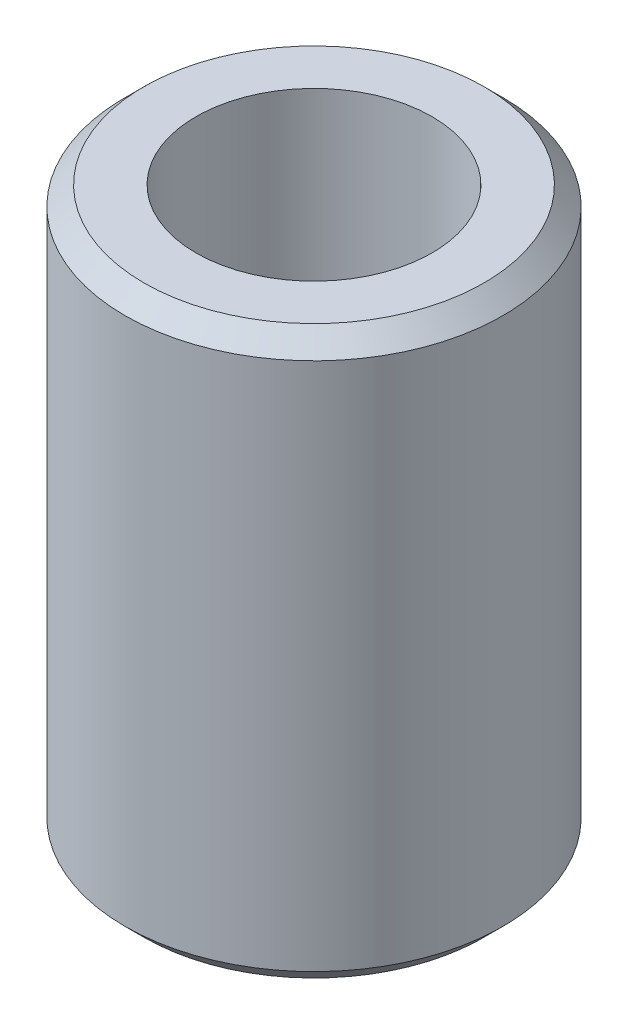
ISO-10303-21;
HEADER;
FILE_DESCRIPTION(('STEP AP214'),'2;1');
FILE_NAME('part.step','',(''),(''),'','','');
FILE_SCHEMA(('AUTOMOTIVE_DESIGN { 1 0 10303 214 1 1 1 1 }'));
ENDSEC;
DATA;
#1=APPLICATION_CONTEXT('core data for automotive mechanical design processes');
#2=APPLICATION_PROTOCOL_DEFINITION('international standard','automotive_design',2000,#1);
#3=PRODUCT_CONTEXT('',#1,'mechanical');
#4=PRODUCT('Part','Part','',(#3));
#5=PRODUCT_RELATED_PRODUCT_CATEGORY('part','',(#4));
#6=PRODUCT_DEFINITION_FORMATION('','',#4);
#7=PRODUCT_DEFINITION_CONTEXT('part definition',#1,'design');
#8=PRODUCT_DEFINITION('design','',#6,#7);
#9=PRODUCT_DEFINITION_SHAPE('','',#8);
#10=(LENGTH_UNIT() NAMED_UNIT(*) SI_UNIT(.MILLI.,.METRE.));
#11=(NAMED_UNIT(*) PLANE_ANGLE_UNIT() SI_UNIT($,.RADIAN.));
#12=(NAMED_UNIT(*) SI_UNIT($,.STERADIAN.) SOLID_ANGLE_UNIT());
#13=UNCERTAINTY_MEASURE_WITH_UNIT(LENGTH_MEASURE(1.E-05),#10,'distance_accuracy_value','');
#14=(GEOMETRIC_REPRESENTATION_CONTEXT(3) GLOBAL_UNCERTAINTY_ASSIGNED_CONTEXT((#13)) GLOBAL_UNIT_ASSIGNED_CONTEXT((#10,
#11,#12)) REPRESENTATION_CONTEXT('',''));
#15=CARTESIAN_POINT('',(0.,0.,0.));
#16=DIRECTION('',(0.,0.,1.));
#17=DIRECTION('',(1.,0.,0.));
#18=AXIS2_PLACEMENT_3D('',#15,#16,#17);
#19=CARTESIAN_POINT('',(0.,60.,0.));
#20=DIRECTION('',(0.,1.,0.));
#21=DIRECTION('',(0.,0.,1.));
#22=AXIS2_PLACEMENT_3D('',#19,#20,#21);
#23=PLANE('',#22);
#24=CARTESIAN_POINT('',(0.,60.,0.));
#25=DIRECTION('',(0.,1.,0.));
#26=DIRECTION('',(0.,0.,1.));
#27=AXIS2_PLACEMENT_3D('',#24,#25,#26);
#28=CIRCLE('',#27,18.);
#29=CARTESIAN_POINT('',(0.,60.,18.));
#30=VERTEX_POINT('',#29);
#31=EDGE_CURVE('E53',#30,#30,#28,.T.);
#32=ORIENTED_EDGE('',*,*,#31,.T.);
#33=EDGE_LOOP('',(#32));
#34=FACE_BOUND('',#33,.T.);
#35=CARTESIAN_POINT('',(0.,60.,0.));
#36=DIRECTION('',(0.,1.,0.));
#37=DIRECTION('',(0.,0.,1.));
#38=AXIS2_PLACEMENT_3D('',#35,#36,#37);
#39=CIRCLE('',#38,12.5);
#40=CARTESIAN_POINT('',(0.,60.,12.5));
#41=VERTEX_POINT('',#40);
#42=EDGE_CURVE('E58',#41,#41,#39,.T.);
#43=ORIENTED_EDGE('',*,*,#42,.F.);
#44=EDGE_LOOP('',(#43));
#45=FACE_BOUND('',#44,.T.);
#46=ADVANCED_FACE('F37',(#34,#45),#23,.T.);
#47=CARTESIAN_POINT('',(0.,0.,0.));
#48=DIRECTION('',(0.,1.,0.));
#49=DIRECTION('',(0.,0.,1.));
#50=AXIS2_PLACEMENT_3D('',#47,#48,#49);
#51=PLANE('',#50);
#52=CARTESIAN_POINT('',(0.,0.,0.));
#53=DIRECTION('',(0.,1.,0.));
#54=DIRECTION('',(0.,0.,1.));
#55=AXIS2_PLACEMENT_3D('',#52,#53,#54);
#56=CIRCLE('',#55,18.);
#57=CARTESIAN_POINT('',(0.,0.,18.));
#58=VERTEX_POINT('',#57);
#59=EDGE_CURVE('E10',#58,#58,#56,.F.);
#60=ORIENTED_EDGE('',*,*,#59,.T.);
#61=EDGE_LOOP('',(#60));
#62=FACE_BOUND('',#61,.T.);
#63=CARTESIAN_POINT('',(0.,0.,0.));
#64=DIRECTION('',(0.,1.,0.));
#65=DIRECTION('',(0.,0.,1.));
#66=AXIS2_PLACEMENT_3D('',#63,#64,#65);
#67=CIRCLE('',#66,12.5);
#68=CARTESIAN_POINT('',(0.,0.,12.5));
#69=VERTEX_POINT('',#68);
#70=EDGE_CURVE('E59',#69,#69,#67,.T.);
#71=ORIENTED_EDGE('',*,*,#70,.T.);
#72=EDGE_LOOP('',(#71));
#73=FACE_BOUND('',#72,.T.);
#74=ADVANCED_FACE('F69',(#62,#73),#51,.F.);
#75=CARTESIAN_POINT('',(0.,60.,0.));
#76=DIRECTION('',(0.,-1.,0.));
#77=DIRECTION('',(0.,0.,-1.));
#78=AXIS2_PLACEMENT_3D('',#75,#76,#77);
#79=CYLINDRICAL_SURFACE('',#78,20.);
#80=CARTESIAN_POINT('',(0.,58.,0.));
#81=DIRECTION('',(0.,1.,0.));
#82=DIRECTION('',(0.,0.,1.));
#83=AXIS2_PLACEMENT_3D('',#80,#81,#82);
#84=CIRCLE('',#83,20.);
#85=CARTESIAN_POINT('',(0.,58.,20.));
#86=VERTEX_POINT('',#85);
#87=EDGE_CURVE('E45',#86,#86,#84,.F.);
#88=ORIENTED_EDGE('',*,*,#87,.T.);
#89=EDGE_LOOP('',(#88));
#90=FACE_BOUND('',#89,.T.);
#91=CARTESIAN_POINT('',(0.,1.99999999999999,0.));
#92=DIRECTION('',(0.,1.,0.));
#93=DIRECTION('',(0.,0.,1.));
#94=AXIS2_PLACEMENT_3D('',#91,#92,#93);
#95=CIRCLE('',#94,20.);
#96=CARTESIAN_POINT('',(0.,1.99999999999999,20.));
#97=VERTEX_POINT('',#96);
#98=EDGE_CURVE('E49',#97,#97,#95,.T.);
#99=ORIENTED_EDGE('',*,*,#98,.T.);
#100=EDGE_LOOP('',(#99));
#101=FACE_BOUND('',#100,.T.);
#102=ADVANCED_FACE('F75',(#90,#101),#79,.T.);
#103=CARTESIAN_POINT('',(0.,60.,0.));
#104=DIRECTION('',(0.,-1.,0.));
#105=DIRECTION('',(0.,0.,-1.));
#106=AXIS2_PLACEMENT_3D('',#103,#104,#105);
#107=CYLINDRICAL_SURFACE('',#106,12.5);
#108=ORIENTED_EDGE('',*,*,#42,.T.);
#109=EDGE_LOOP('',(#108));
#110=FACE_BOUND('',#109,.T.);
#111=ORIENTED_EDGE('',*,*,#70,.F.);
#112=EDGE_LOOP('',(#111));
#113=FACE_BOUND('',#112,.T.);
#114=ADVANCED_FACE('F65',(#110,#113),#107,.F.);
#115=CARTESIAN_POINT('',(0.,60.,0.));
#116=DIRECTION('',(0.,-1.,0.));
#117=DIRECTION('',(0.,0.,-1.));
#118=AXIS2_PLACEMENT_3D('',#115,#116,#117);
#119=CONICAL_SURFACE('',#118,18.,0.78539816339745);
#120=ORIENTED_EDGE('',*,*,#87,.F.);
#121=EDGE_LOOP('',(#120));
#122=FACE_BOUND('',#121,.T.);
#123=ORIENTED_EDGE('',*,*,#31,.F.);
#124=EDGE_LOOP('',(#123));
#125=FACE_BOUND('',#124,.T.);
#126=ADVANCED_FACE('F81',(#122,#125),#119,.T.);
#127=CARTESIAN_POINT('',(0.,1.99999999999999,0.));
#128=DIRECTION('',(0.,1.,0.));
#129=DIRECTION('',(0.,0.,1.));
#130=AXIS2_PLACEMENT_3D('',#127,#128,#129);
#131=CONICAL_SURFACE('',#130,20.,0.78539816339745);
#132=ORIENTED_EDGE('',*,*,#59,.F.);
#133=EDGE_LOOP('',(#132));
#134=FACE_BOUND('',#133,.T.);
#135=ORIENTED_EDGE('',*,*,#98,.F.);
#136=EDGE_LOOP('',(#135));
#137=FACE_BOUND('',#136,.T.);
#138=ADVANCED_FACE('F40',(#134,#137),#131,.T.);
#139=CLOSED_SHELL('',(#46,#74,#102,#114,#126,#138));
#140=MANIFOLD_SOLID_BREP('B2',#139);
#141=ADVANCED_BREP_SHAPE_REPRESENTATION('',(#18,#140),#14);
#142=SHAPE_DEFINITION_REPRESENTATION(#9,#141);
ENDSEC;
END-ISO-10303-21;
